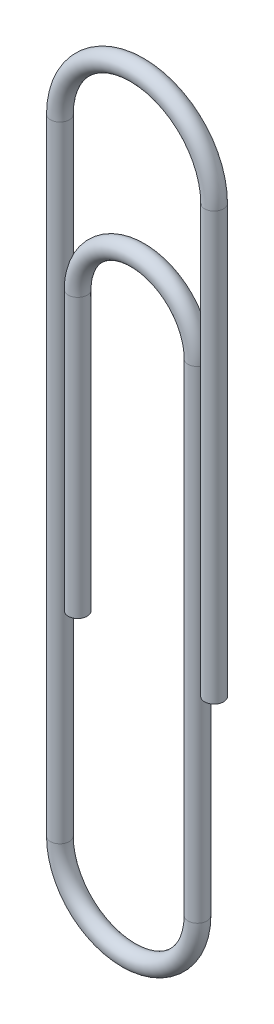
ISO-10303-21;
HEADER;
FILE_DESCRIPTION(('STEP AP214'),'2;1');
FILE_NAME('part.step','',(''),(''),'','','');
FILE_SCHEMA(('AUTOMOTIVE_DESIGN { 1 0 10303 214 1 1 1 1 }'));
ENDSEC;
DATA;
#1=APPLICATION_CONTEXT('core data for automotive mechanical design processes');
#2=APPLICATION_PROTOCOL_DEFINITION('international standard','automotive_design',2000,#1);
#3=PRODUCT_CONTEXT('',#1,'mechanical');
#4=PRODUCT('Part','Part','',(#3));
#5=PRODUCT_RELATED_PRODUCT_CATEGORY('part','',(#4));
#6=PRODUCT_DEFINITION_FORMATION('','',#4);
#7=PRODUCT_DEFINITION_CONTEXT('part definition',#1,'design');
#8=PRODUCT_DEFINITION('design','',#6,#7);
#9=PRODUCT_DEFINITION_SHAPE('','',#8);
#10=(LENGTH_UNIT() NAMED_UNIT(*) SI_UNIT(.MILLI.,.METRE.));
#11=(NAMED_UNIT(*) PLANE_ANGLE_UNIT() SI_UNIT($,.RADIAN.));
#12=(NAMED_UNIT(*) SI_UNIT($,.STERADIAN.) SOLID_ANGLE_UNIT());
#13=UNCERTAINTY_MEASURE_WITH_UNIT(LENGTH_MEASURE(1.E-05),#10,'distance_accuracy_value','');
#14=(GEOMETRIC_REPRESENTATION_CONTEXT(3) GLOBAL_UNCERTAINTY_ASSIGNED_CONTEXT((#13)) GLOBAL_UNIT_ASSIGNED_CONTEXT((#10,
#11,#12)) REPRESENTATION_CONTEXT('',''));
#15=CARTESIAN_POINT('',(0.,0.,0.));
#16=DIRECTION('',(0.,0.,1.));
#17=DIRECTION('',(1.,0.,0.));
#18=AXIS2_PLACEMENT_3D('',#15,#16,#17);
#19=CARTESIAN_POINT('',(0.762000000000002,-18.034,0.));
#20=DIRECTION('',(0.,1.,0.));
#21=DIRECTION('',(-1.,0.,0.));
#22=AXIS2_PLACEMENT_3D('',#19,#20,#21);
#23=CYLINDRICAL_SURFACE('',#22,0.40513);
#24=CARTESIAN_POINT('',(0.762000000000002,-18.034,0.));
#25=DIRECTION('',(0.,-1.,0.));
#26=DIRECTION('',(0.,0.,1.));
#27=AXIS2_PLACEMENT_3D('',#24,#25,#26);
#28=CIRCLE('',#27,0.40513);
#29=CARTESIAN_POINT('',(0.381,-18.034,-0.137729143248618));
#30=VERTEX_POINT('',#29);
#31=CARTESIAN_POINT('',(0.381,-18.034,0.137729143248618));
#32=VERTEX_POINT('',#31);
#33=EDGE_CURVE('E156',#30,#32,#28,.T.);
#34=ORIENTED_EDGE('',*,*,#33,.F.);
#35=DIRECTION('',(0.,1.,0.));
#36=VECTOR('',#35,1.);
#37=CARTESIAN_POINT('',(0.381,-12.0777,-0.137729143248618));
#38=LINE('',#37,#36);
#39=CARTESIAN_POINT('',(0.381,-6.1214,-0.137729143248622));
#40=VERTEX_POINT('',#39);
#41=EDGE_CURVE('E57',#30,#40,#38,.T.);
#42=ORIENTED_EDGE('',*,*,#41,.T.);
#43=CARTESIAN_POINT('',(0.762000000000001,-6.1214,0.));
#44=DIRECTION('',(0.,-1.,0.));
#45=DIRECTION('',(0.,0.,1.));
#46=AXIS2_PLACEMENT_3D('',#43,#44,#45);
#47=CIRCLE('',#46,0.40513);
#48=CARTESIAN_POINT('',(0.380999999999999,-6.1214,0.137729143248622));
#49=VERTEX_POINT('',#48);
#50=EDGE_CURVE('E160',#40,#49,#47,.T.);
#51=ORIENTED_EDGE('',*,*,#50,.T.);
#52=DIRECTION('',(0.,1.,0.));
#53=VECTOR('',#52,1.);
#54=CARTESIAN_POINT('',(0.381,-12.0777,0.137729143248618));
#55=LINE('',#54,#53);
#56=EDGE_CURVE('E123',#49,#32,#55,.F.);
#57=ORIENTED_EDGE('',*,*,#56,.T.);
#58=EDGE_LOOP('',(#34,#42,#51,#57));
#59=FACE_BOUND('',#58,.T.);
#60=ADVANCED_FACE('F49',(#59),#23,.T.);
#61=CARTESIAN_POINT('',(0.,-26.7716,0.));
#62=DIRECTION('',(0.,1.,0.));
#63=DIRECTION('',(-1.,0.,0.));
#64=AXIS2_PLACEMENT_3D('',#61,#62,#63);
#65=CYLINDRICAL_SURFACE('',#64,0.40513);
#66=CARTESIAN_POINT('',(0.,-26.7716,0.));
#67=DIRECTION('',(0.,-1.,0.));
#68=DIRECTION('',(0.,0.,1.));
#69=AXIS2_PLACEMENT_3D('',#66,#67,#68);
#70=CIRCLE('',#69,0.40513);
#71=CARTESIAN_POINT('',(-0.40513000000001,-26.7716,0.));
#72=VERTEX_POINT('',#71);
#73=EDGE_CURVE('E168',#72,#72,#70,.T.);
#74=ORIENTED_EDGE('',*,*,#73,.F.);
#75=EDGE_LOOP('',(#74));
#76=FACE_BOUND('',#75,.T.);
#77=CARTESIAN_POINT('',(0.,0.,0.));
#78=DIRECTION('',(0.,-1.,0.));
#79=DIRECTION('',(0.,0.,1.));
#80=AXIS2_PLACEMENT_3D('',#77,#78,#79);
#81=CIRCLE('',#80,0.40513);
#82=CARTESIAN_POINT('',(-0.40513,0.,0.));
#83=VERTEX_POINT('',#82);
#84=EDGE_CURVE('E170',#83,#83,#81,.T.);
#85=ORIENTED_EDGE('',*,*,#84,.T.);
#86=EDGE_LOOP('',(#85));
#87=FACE_BOUND('',#86,.T.);
#88=CARTESIAN_POINT('',(0.,-18.034,0.));
#89=DIRECTION('',(0.,-1.,0.));
#90=DIRECTION('',(1.,0.,0.));
#91=AXIS2_PLACEMENT_3D('',#88,#89,#90);
#92=CIRCLE('',#91,0.40513);
#93=EDGE_CURVE('E12',#32,#30,#92,.F.);
#94=ORIENTED_EDGE('',*,*,#93,.F.);
#95=ORIENTED_EDGE('',*,*,#56,.F.);
#96=CARTESIAN_POINT('',(0.381000003393972,-6.1216,-0.137729133859879));
#97=CARTESIAN_POINT('',(0.38099737381296,-6.0893599079405,-0.137696957000012));
#98=CARTESIAN_POINT('',(0.381262247281425,-6.05710406815611,-0.136998603104684));
#99=CARTESIAN_POINT('',(0.382322680293788,-5.99241213690515,-0.134035304486696));
#100=CARTESIAN_POINT('',(0.383122535190939,-5.95997671094613,-0.131757674317877));
#101=CARTESIAN_POINT('',(0.385360119186623,-5.89190612814933,-0.125060372371321));
#102=CARTESIAN_POINT('',(0.386856052659302,-5.85629295393935,-0.120440734284192));
#103=CARTESIAN_POINT('',(0.390459821142249,-5.7856629326276,-0.10825390920335));
#104=CARTESIAN_POINT('',(0.392565081964074,-5.7506442197724,-0.100699077302106));
#105=CARTESIAN_POINT('',(0.395981093909334,-5.70091523905321,-0.0857299566300366));
#106=CARTESIAN_POINT('',(0.397099464722232,-5.68553917103656,-0.0804834396525123));
#107=CARTESIAN_POINT('',(0.39939228746471,-5.65558896448649,-0.06825147436647));
#108=CARTESIAN_POINT('',(0.400565980080602,-5.64100782460978,-0.0612859521157582));
#109=CARTESIAN_POINT('',(0.40206495612836,-5.6231197726422,-0.0498129887510318));
#110=CARTESIAN_POINT('',(0.402426948123193,-5.61886004781515,-0.0468313579807456));
#111=CARTESIAN_POINT('',(0.403126313424375,-5.61072593679224,-0.0403764972656626));
#112=CARTESIAN_POINT('',(0.403463742653049,-5.60685066749879,-0.036904440534465));
#113=CARTESIAN_POINT('',(0.403951435486054,-5.60130329540823,-0.0309542571519284));
#114=CARTESIAN_POINT('',(0.404119646856912,-5.59940193418843,-0.0286934789521682));
#115=CARTESIAN_POINT('',(0.404429448528994,-5.59591630590607,-0.0239337764022004));
#116=CARTESIAN_POINT('',(0.404571063478273,-5.59433174516199,-0.0214350758144149));
#117=CARTESIAN_POINT('',(0.404788674566032,-5.59190499096053,-0.0167539280402759));
#118=CARTESIAN_POINT('',(0.404872220703653,-5.59097658709636,-0.0146172195103003));
#119=CARTESIAN_POINT('',(0.405007018148854,-5.58948113527428,-0.0102199731126544));
#120=CARTESIAN_POINT('',(0.405058319631452,-5.58891352587844,-0.0079596336121244));
#121=CARTESIAN_POINT('',(0.405122718445436,-5.58820130254118,-0.00335200823382812));
#122=CARTESIAN_POINT('',(0.40513550722718,-5.58806010482857,-0.00100417192435453));
#123=CARTESIAN_POINT('',(0.405120090359283,-5.58823047527601,0.00367516097912712));
#124=CARTESIAN_POINT('',(0.405091872585599,-5.58854217734089,0.00600665253581335));
#125=CARTESIAN_POINT('',(0.405003691691207,-5.58951833710157,0.0103182755450171));
#126=CARTESIAN_POINT('',(0.404947608345968,-5.59013970551572,0.0123086449460144));
#127=CARTESIAN_POINT('',(0.404811361404428,-5.59165311835939,0.0161813271662734));
#128=CARTESIAN_POINT('',(0.404731188123366,-5.59254527165273,0.018063596163252));
#129=CARTESIAN_POINT('',(0.404485284956892,-5.59529054097772,0.0230684880169761));
#130=CARTESIAN_POINT('',(0.404300353571377,-5.59736397228914,0.0260686252940436));
#131=CARTESIAN_POINT('',(0.403895843361424,-5.601932411107,0.0317256205998431));
#132=CARTESIAN_POINT('',(0.403676146479695,-5.6044288572176,0.0343812506986125));
#133=CARTESIAN_POINT('',(0.402984327805553,-5.6123557581032,0.0419539167887941));
#134=CARTESIAN_POINT('',(0.402482098865102,-5.61819489985315,0.0464341531020902));
#135=CARTESIAN_POINT('',(0.401453121713155,-5.63039009356597,0.0546075438931368));
#136=CARTESIAN_POINT('',(0.400926298049081,-5.63674778793054,0.0582980518930828));
#137=CARTESIAN_POINT('',(0.398567177338567,-5.66583186865445,0.0736658374245626));
#138=CARTESIAN_POINT('',(0.396738533282855,-5.69003806118057,0.0824439120169206));
#139=CARTESIAN_POINT('',(0.393332025262814,-5.73933884491862,0.0973047481328133));
#140=CARTESIAN_POINT('',(0.391756757234866,-5.76443976330218,0.103360626168129));
#141=CARTESIAN_POINT('',(0.388767566481855,-5.81756843544821,0.11413352355212));
#142=CARTESIAN_POINT('',(0.387385197019475,-5.84563932199341,0.118657886957347));
#143=CARTESIAN_POINT('',(0.385015617785918,-5.90202464007202,0.126124149224606));
#144=CARTESIAN_POINT('',(0.384028949434618,-5.93033935151232,0.12906388178644));
#145=CARTESIAN_POINT('',(0.382497226023362,-5.9858277180761,0.133536313105526));
#146=CARTESIAN_POINT('',(0.381934536196971,-6.01299632520191,0.135125598945858));
#147=CARTESIAN_POINT('',(0.38118562752823,-6.06731183783087,0.137214060852142));
#148=CARTESIAN_POINT('',(0.380998451759136,-6.09445862182636,0.137716008056847));
#149=CARTESIAN_POINT('',(0.381000003393972,-6.1216,0.137729133859879));
#150=B_SPLINE_CURVE_WITH_KNOTS('',3,(#96,#97,#98,#99,#100,#101,#102,#103,#104,#105,#106,#107,
#108,#109,#110,#111,#112,#113,#114,#115,#116,#117,#118,#119,#120,#121,#122,#123,#124,#125,#126,
#127,#128,#129,#130,#131,#132,#133,#134,#135,#136,#137,#138,#139,#140,#141,#142,#143,#144,#145,
#146,#147,#148,#149),.UNSPECIFIED.,.F.,.F.,(4,2,2,2,2,2,2,2,2,2,2,2,2,2,2,2,2,2,2,2,2,2,2,2,2,2,
4),(0.,0.0967393816389853,0.19426495723312,0.302040263369481,0.409366742622249,
0.458195068558925,0.506481992313873,0.522096468535503,0.537674204740176,0.546532021220061,
0.555381587827218,0.5623493101552,0.569306163184507,0.57631860563789,0.583333121819507,
0.589567482171719,0.595804352255154,0.606695027977151,0.61762351308653,0.639631232519669,
0.661711585995913,0.738568953290769,0.816169504038882,0.901475586464839,0.986897994346757,
1.06853435064392,1.14996240648472),.UNSPECIFIED.);
#151=EDGE_CURVE('E92',#40,#49,#150,.T.);
#152=ORIENTED_EDGE('',*,*,#151,.F.);
#153=ORIENTED_EDGE('',*,*,#41,.F.);
#154=EDGE_LOOP('',(#94,#95,#152,#153));
#155=FACE_BOUND('',#154,.T.);
#156=ADVANCED_FACE('F124',(#76,#87,#155),#65,.T.);
#157=CARTESIAN_POINT('',(3.3274,-6.1214,0.));
#158=DIRECTION('',(0.,0.,-1.));
#159=DIRECTION('',(-1.,0.,0.));
#160=AXIS2_PLACEMENT_3D('',#157,#158,#159);
#161=TOROIDAL_SURFACE('',#160,2.5654,0.40513);
#162=CARTESIAN_POINT('',(5.89279999999999,-6.1214,0.));
#163=DIRECTION('',(0.,1.,0.));
#164=DIRECTION('',(0.,0.,1.));
#165=AXIS2_PLACEMENT_3D('',#162,#163,#164);
#166=CIRCLE('',#165,0.40513);
#167=CARTESIAN_POINT('',(6.2484,-6.1214,-0.194110682086271));
#168=VERTEX_POINT('',#167);
#169=CARTESIAN_POINT('',(6.2484,-6.1214,0.194110682086271));
#170=VERTEX_POINT('',#169);
#171=EDGE_CURVE('E104',#168,#170,#166,.T.);
#172=ORIENTED_EDGE('',*,*,#171,.T.);
#173=CARTESIAN_POINT('',(6.24839999657651,-6.1216,0.194110675814636));
#174=CARTESIAN_POINT('',(6.24840176242926,-6.08816987916557,0.194100458487199));
#175=CARTESIAN_POINT('',(6.24811535905282,-6.05473693403815,0.193588346863194));
#176=CARTESIAN_POINT('',(6.24696984155279,-5.9878845716555,0.191474971409065));
#177=CARTESIAN_POINT('',(6.24611019406485,-5.95446519602859,0.189872693225458));
#178=CARTESIAN_POINT('',(6.24381391981844,-5.88749098514452,0.185478190540368));
#179=CARTESIAN_POINT('',(6.24237334635952,-5.85393681004683,0.182677818320509));
#180=CARTESIAN_POINT('',(6.23892575393686,-5.78701185840641,0.1756894089066));
#181=CARTESIAN_POINT('',(6.23691898317205,-5.75364100802126,0.171501979604885));
#182=CARTESIAN_POINT('',(6.23236792955435,-5.68733243213752,0.161400776397099));
#183=CARTESIAN_POINT('',(6.22982579636478,-5.65439351794329,0.155493871560987));
#184=CARTESIAN_POINT('',(6.22423459693876,-5.58903711403774,0.14131639493416));
#185=CARTESIAN_POINT('',(6.22118571924722,-5.55661943529171,0.133046701448605));
#186=CARTESIAN_POINT('',(6.21631338669713,-5.50889993126737,0.117714621023707));
#187=CARTESIAN_POINT('',(6.21463649096037,-5.49311987085178,0.112104573610402));
#188=CARTESIAN_POINT('',(6.2112234375653,-5.46215241673307,0.0995039449084598));
#189=CARTESIAN_POINT('',(6.20948750248874,-5.44696317867686,0.0925181565266258));
#190=CARTESIAN_POINT('',(6.20706097861459,-5.42638809552178,0.0811218351265689));
#191=CARTESIAN_POINT('',(6.20635762460566,-5.42050327559766,0.0776220159664562));
#192=CARTESIAN_POINT('',(6.20496835775441,-5.40901796805984,0.0701337899940416));
#193=CARTESIAN_POINT('',(6.20428250494499,-5.40341840674021,0.066143919220701));
#194=CARTESIAN_POINT('',(6.20294610786854,-5.39262515887592,0.0574945036575762));
#195=CARTESIAN_POINT('',(6.20229615511219,-5.38743786704894,0.0528267518004943));
#196=CARTESIAN_POINT('',(6.20109216969101,-5.37791703062993,0.0426788577393081));
#197=CARTESIAN_POINT('',(6.20053757517361,-5.37357846289124,0.0372038539411295));
#198=CARTESIAN_POINT('',(6.19985853029202,-5.36829869094262,0.0284250003954306));
#199=CARTESIAN_POINT('',(6.19966088970366,-5.3667679791665,0.0254850445584834));
#200=CARTESIAN_POINT('',(6.19932356953602,-5.3641611412396,0.0194050705901797));
#201=CARTESIAN_POINT('',(6.19918383386709,-5.363084575162,0.0162652494763684));
#202=CARTESIAN_POINT('',(6.19897579884755,-5.36148352440486,0.00980863311901865));
#203=CARTESIAN_POINT('',(6.19890821207282,-5.36096454640524,0.00649040651007615));
#204=CARTESIAN_POINT('',(6.19885632399286,-5.36056600909715,-0.000184804918898379));
#205=CARTESIAN_POINT('',(6.19887197955655,-5.36068611865275,-0.00354176876809853));
#206=CARTESIAN_POINT('',(6.198978247268,-5.3615027185649,-0.00982688130740253));
#207=CARTESIAN_POINT('',(6.19906093957568,-5.36213831201893,-0.0127634716944396));
#208=CARTESIAN_POINT('',(6.19928258209134,-5.36384561946804,-0.0185039989360805));
#209=CARTESIAN_POINT('',(6.19942157766284,-5.3649176851322,-0.0213078267846046));
#210=CARTESIAN_POINT('',(6.19983216323402,-5.3680937890643,-0.0282194265472186));
#211=CARTESIAN_POINT('',(6.20013480678188,-5.37044236079157,-0.0322121339314916));
#212=CARTESIAN_POINT('',(6.20081043843816,-5.37571676370262,-0.0397871065804802));
#213=CARTESIAN_POINT('',(6.20118361915659,-5.37864417651349,-0.0433682037952025));
#214=CARTESIAN_POINT('',(6.20232033472583,-5.3876230584774,-0.0531551846697426));
#215=CARTESIAN_POINT('',(6.20313879108131,-5.39415976109983,-0.0589032178508564));
#216=CARTESIAN_POINT('',(6.20483635461363,-5.40792541581262,-0.0694770678814853));
#217=CARTESIAN_POINT('',(6.20571565688917,-5.41515662655363,-0.0742997115723078));
#218=CARTESIAN_POINT('',(6.20803233275869,-5.43452495219672,-0.0859910899246165));
#219=CARTESIAN_POINT('',(6.20948482306879,-5.44697824478233,-0.0923274873124854));
#220=CARTESIAN_POINT('',(6.21236596001252,-5.47241202677451,-0.103862909173851));
#221=CARTESIAN_POINT('',(6.21379454117657,-5.48539370787752,-0.109059172063506));
#222=CARTESIAN_POINT('',(6.21802012221844,-5.52502918032104,-0.123503414742914));
#223=CARTESIAN_POINT('',(6.22072950908628,-5.55214637563877,-0.131490223778054));
#224=CARTESIAN_POINT('',(6.2275065311136,-5.62520530202773,-0.150119543320085));
#225=CARTESIAN_POINT('',(6.23127020323782,-5.67160393104631,-0.158964079861898));
#226=CARTESIAN_POINT('',(6.2377217586449,-5.76508299460403,-0.173283354918811));
#227=CARTESIAN_POINT('',(6.24040657374114,-5.81216498458901,-0.178748506141196));
#228=CARTESIAN_POINT('',(6.2444829020455,-5.90305760904571,-0.186809139448667));
#229=CARTESIAN_POINT('',(6.24595629922764,-5.94684880828151,-0.189589078583059));
#230=CARTESIAN_POINT('',(6.24791393735304,-6.0342974132048,-0.193216354872811));
#231=CARTESIAN_POINT('',(6.24840349176165,-6.07795425919335,-0.194074076311627));
#232=CARTESIAN_POINT('',(6.24839999657651,-6.1216,-0.194110675814639));
#233=B_SPLINE_CURVE_WITH_KNOTS('',3,(#173,#174,#175,#176,#177,#178,#179,#180,#181,#182,#183,
#184,#185,#186,#187,#188,#189,#190,#191,#192,#193,#194,#195,#196,#197,#198,#199,#200,#201,#202,
#203,#204,#205,#206,#207,#208,#209,#210,#211,#212,#213,#214,#215,#216,#217,#218,#219,#220,#221,
#222,#223,#224,#225,#226,#227,#228,#229,#230,#231,#232),.UNSPECIFIED.,.F.,.F.,(4,2,2,2,2,2,2,2,
2,2,2,2,2,2,2,2,2,2,2,2,2,2,2,2,2,2,2,2,2,4),(0.,0.100289769016622,0.200672981229211,
0.301749987144082,0.402782753480345,0.5034173204607,0.604014527721797,0.654476259089586,
0.704765202807841,0.725398211687738,0.746094430615491,0.767066135907877,0.78790969337292,
0.797841321058379,0.807763305850267,0.817782402992848,0.827796309360139,0.83677452848387,
0.845759995789853,0.859605931413738,0.873490235953305,0.899571787413376,0.925741233968312,
0.967777765958035,1.0099150197192,1.09495320398217,1.23688250544784,1.37921263385917,
1.51086985368035,1.64181409721882),.UNSPECIFIED.);
#234=EDGE_CURVE('E105',#170,#168,#233,.T.);
#235=ORIENTED_EDGE('',*,*,#234,.T.);
#236=EDGE_LOOP('',(#172,#235));
#237=FACE_BOUND('',#236,.T.);
#238=ORIENTED_EDGE('',*,*,#50,.F.);
#239=ORIENTED_EDGE('',*,*,#151,.T.);
#240=EDGE_LOOP('',(#238,#239));
#241=FACE_BOUND('',#240,.T.);
#242=ADVANCED_FACE('F128',(#237,#241),#161,.T.);
#243=CARTESIAN_POINT('',(5.89279999999999,-6.1214,0.));
#244=DIRECTION('',(0.,-1.,0.));
#245=DIRECTION('',(1.,0.,0.));
#246=AXIS2_PLACEMENT_3D('',#243,#244,#245);
#247=CYLINDRICAL_SURFACE('',#246,0.40513);
#248=CARTESIAN_POINT('',(5.89279999999999,-26.7716,0.));
#249=DIRECTION('',(0.,1.,0.));
#250=DIRECTION('',(0.,0.,1.));
#251=AXIS2_PLACEMENT_3D('',#248,#249,#250);
#252=CIRCLE('',#251,0.40513);
#253=CARTESIAN_POINT('',(6.29793,-26.7716,0.));
#254=VERTEX_POINT('',#253);
#255=EDGE_CURVE('E165',#254,#254,#252,.T.);
#256=ORIENTED_EDGE('',*,*,#255,.T.);
#257=EDGE_LOOP('',(#256));
#258=FACE_BOUND('',#257,.T.);
#259=ORIENTED_EDGE('',*,*,#171,.F.);
#260=DIRECTION('',(0.,-1.,0.));
#261=VECTOR('',#260,1.);
#262=CARTESIAN_POINT('',(6.2484,-16.4465,-0.19411068208627));
#263=LINE('',#262,#261);
#264=CARTESIAN_POINT('',(6.2484,-18.288,-0.194110682086269));
#265=VERTEX_POINT('',#264);
#266=EDGE_CURVE('E93',#168,#265,#263,.T.);
#267=ORIENTED_EDGE('',*,*,#266,.T.);
#268=CARTESIAN_POINT('',(5.89279999999999,-18.288,0.));
#269=DIRECTION('',(0.,1.,0.));
#270=DIRECTION('',(0.,0.,1.));
#271=AXIS2_PLACEMENT_3D('',#268,#269,#270);
#272=CIRCLE('',#271,0.40513);
#273=CARTESIAN_POINT('',(6.2484,-18.288,0.194110682086269));
#274=VERTEX_POINT('',#273);
#275=EDGE_CURVE('E85',#265,#274,#272,.F.);
#276=ORIENTED_EDGE('',*,*,#275,.T.);
#277=DIRECTION('',(0.,-1.,0.));
#278=VECTOR('',#277,1.);
#279=CARTESIAN_POINT('',(6.2484,-16.4465,0.19411068208627));
#280=LINE('',#279,#278);
#281=EDGE_CURVE('E98',#274,#170,#280,.F.);
#282=ORIENTED_EDGE('',*,*,#281,.T.);
#283=EDGE_LOOP('',(#259,#267,#276,#282));
#284=FACE_BOUND('',#283,.T.);
#285=ADVANCED_FACE('F102',(#258,#284),#247,.T.);
#286=CARTESIAN_POINT('',(6.604,0.,0.));
#287=DIRECTION('',(0.,-1.,0.));
#288=DIRECTION('',(1.,0.,0.));
#289=AXIS2_PLACEMENT_3D('',#286,#287,#288);
#290=CYLINDRICAL_SURFACE('',#289,0.40513);
#291=CARTESIAN_POINT('',(6.604,0.,0.));
#292=DIRECTION('',(0.,1.,0.));
#293=DIRECTION('',(0.,0.,1.));
#294=AXIS2_PLACEMENT_3D('',#291,#292,#293);
#295=CIRCLE('',#294,0.40513);
#296=CARTESIAN_POINT('',(7.00913,0.,0.));
#297=VERTEX_POINT('',#296);
#298=EDGE_CURVE('E99',#297,#297,#295,.T.);
#299=ORIENTED_EDGE('',*,*,#298,.F.);
#300=EDGE_LOOP('',(#299));
#301=FACE_BOUND('',#300,.T.);
#302=ORIENTED_EDGE('',*,*,#266,.F.);
#303=ORIENTED_EDGE('',*,*,#234,.F.);
#304=ORIENTED_EDGE('',*,*,#281,.F.);
#305=CARTESIAN_POINT('',(6.604,-18.288,0.));
#306=DIRECTION('',(0.,1.,0.));
#307=DIRECTION('',(0.,0.,1.));
#308=AXIS2_PLACEMENT_3D('',#305,#306,#307);
#309=CIRCLE('',#308,0.40513);
#310=EDGE_CURVE('E88',#274,#265,#309,.T.);
#311=ORIENTED_EDGE('',*,*,#310,.T.);
#312=EDGE_LOOP('',(#302,#303,#304,#311));
#313=FACE_BOUND('',#312,.T.);
#314=ADVANCED_FACE('F96',(#301,#313),#290,.T.);
#315=CARTESIAN_POINT('',(0.762000000000002,-18.034,0.));
#316=DIRECTION('',(0.,-1.,0.));
#317=DIRECTION('',(0.,0.,1.));
#318=AXIS2_PLACEMENT_3D('',#315,#316,#317);
#319=PLANE('',#318);
#320=ORIENTED_EDGE('',*,*,#33,.T.);
#321=ORIENTED_EDGE('',*,*,#93,.T.);
#322=EDGE_LOOP('',(#320,#321));
#323=FACE_BOUND('',#322,.T.);
#324=ADVANCED_FACE('F51',(#323),#319,.T.);
#325=CARTESIAN_POINT('',(6.604,-18.288,0.));
#326=DIRECTION('',(0.,1.,0.));
#327=DIRECTION('',(0.,0.,1.));
#328=AXIS2_PLACEMENT_3D('',#325,#326,#327);
#329=PLANE('',#328);
#330=ORIENTED_EDGE('',*,*,#275,.F.);
#331=ORIENTED_EDGE('',*,*,#310,.F.);
#332=EDGE_LOOP('',(#330,#331));
#333=FACE_BOUND('',#332,.T.);
#334=ADVANCED_FACE('F87',(#333),#329,.F.);
#335=CARTESIAN_POINT('',(2.94639999999999,-26.7716,0.));
#336=DIRECTION('',(0.,0.,-1.));
#337=DIRECTION('',(-1.,0.,0.));
#338=AXIS2_PLACEMENT_3D('',#335,#336,#337);
#339=TOROIDAL_SURFACE('',#338,2.9464,0.40513);
#340=CARTESIAN_POINT('',(2.94639999999999,-26.7716,0.));
#341=DIRECTION('',(0.,0.,-1.));
#342=DIRECTION('',(-1.,0.,0.));
#343=AXIS2_PLACEMENT_3D('',#340,#341,#342);
#344=CIRCLE('',#343,3.35153);
#345=EDGE_CURVE('',#254,#72,#344,.T.);
#346=ORIENTED_EDGE('',*,*,#255,.F.);
#347=ORIENTED_EDGE('',*,*,#73,.T.);
#348=ORIENTED_EDGE('',*,*,#345,.T.);
#349=ORIENTED_EDGE('',*,*,#345,.F.);
#350=EDGE_LOOP('',(#346,#348,#347,#349));
#351=FACE_BOUND('',#350,.T.);
#352=ADVANCED_FACE('F137',(#351),#339,.T.);
#353=CARTESIAN_POINT('',(3.302,0.,0.));
#354=DIRECTION('',(0.,0.,-1.));
#355=DIRECTION('',(-1.,0.,0.));
#356=AXIS2_PLACEMENT_3D('',#353,#354,#355);
#357=TOROIDAL_SURFACE('',#356,3.302,0.40513);
#358=CARTESIAN_POINT('',(3.302,0.,0.));
#359=DIRECTION('',(0.,0.,-1.));
#360=DIRECTION('',(-1.,0.,0.));
#361=AXIS2_PLACEMENT_3D('',#358,#359,#360);
#362=CIRCLE('',#361,3.70713);
#363=EDGE_CURVE('',#83,#297,#362,.T.);
#364=ORIENTED_EDGE('',*,*,#84,.F.);
#365=ORIENTED_EDGE('',*,*,#298,.T.);
#366=ORIENTED_EDGE('',*,*,#363,.T.);
#367=ORIENTED_EDGE('',*,*,#363,.F.);
#368=EDGE_LOOP('',(#364,#366,#365,#367));
#369=FACE_BOUND('',#368,.T.);
#370=ADVANCED_FACE('F139',(#369),#357,.T.);
#371=CLOSED_SHELL('',(#60,#156,#242,#285,#314,#324,#334,#352,#370));
#372=MANIFOLD_SOLID_BREP('B2',#371);
#373=ADVANCED_BREP_SHAPE_REPRESENTATION('',(#18,#372),#14);
#374=SHAPE_DEFINITION_REPRESENTATION(#9,#373);
ENDSEC;
END-ISO-10303-21;
